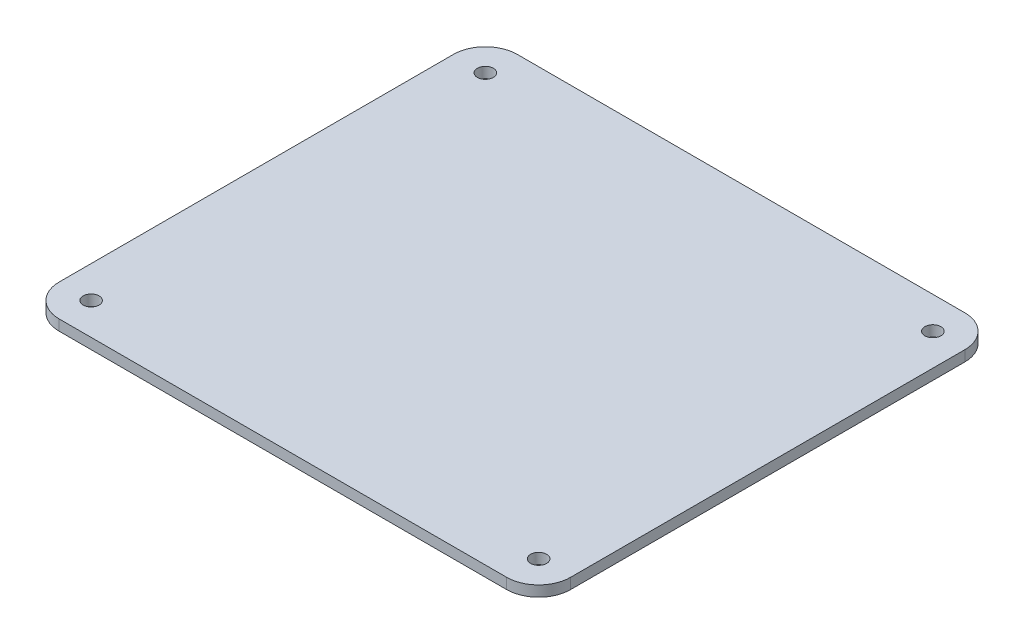
ISO-10303-21;
HEADER;
FILE_DESCRIPTION(('STEP AP214'),'2;1');
FILE_NAME('part.step','',(''),(''),'','','');
FILE_SCHEMA(('AUTOMOTIVE_DESIGN { 1 0 10303 214 1 1 1 1 }'));
ENDSEC;
DATA;
#1=APPLICATION_CONTEXT('core data for automotive mechanical design processes');
#2=APPLICATION_PROTOCOL_DEFINITION('international standard','automotive_design',2000,#1);
#3=PRODUCT_CONTEXT('',#1,'mechanical');
#4=PRODUCT('Part','Part','',(#3));
#5=PRODUCT_RELATED_PRODUCT_CATEGORY('part','',(#4));
#6=PRODUCT_DEFINITION_FORMATION('','',#4);
#7=PRODUCT_DEFINITION_CONTEXT('part definition',#1,'design');
#8=PRODUCT_DEFINITION('design','',#6,#7);
#9=PRODUCT_DEFINITION_SHAPE('','',#8);
#10=(LENGTH_UNIT() NAMED_UNIT(*) SI_UNIT(.MILLI.,.METRE.));
#11=(NAMED_UNIT(*) PLANE_ANGLE_UNIT() SI_UNIT($,.RADIAN.));
#12=(NAMED_UNIT(*) SI_UNIT($,.STERADIAN.) SOLID_ANGLE_UNIT());
#13=UNCERTAINTY_MEASURE_WITH_UNIT(LENGTH_MEASURE(1.E-05),#10,'distance_accuracy_value','');
#14=(GEOMETRIC_REPRESENTATION_CONTEXT(3) GLOBAL_UNCERTAINTY_ASSIGNED_CONTEXT((#13)) GLOBAL_UNIT_ASSIGNED_CONTEXT((#10,
#11,#12)) REPRESENTATION_CONTEXT('',''));
#15=CARTESIAN_POINT('',(0.,0.,0.));
#16=DIRECTION('',(0.,0.,1.));
#17=DIRECTION('',(1.,0.,0.));
#18=AXIS2_PLACEMENT_3D('',#15,#16,#17);
#19=CARTESIAN_POINT('',(-42.,2.,37.));
#20=DIRECTION('',(0.,-1.,0.));
#21=DIRECTION('',(0.,0.,-1.));
#22=AXIS2_PLACEMENT_3D('',#19,#20,#21);
#23=PLANE('',#22);
#24=CARTESIAN_POINT('',(-42.,2.,37.));
#25=DIRECTION('',(0.,1.,0.));
#26=DIRECTION('',(0.,0.,-1.));
#27=AXIS2_PLACEMENT_3D('',#24,#25,#26);
#28=CIRCLE('',#27,6.);
#29=CARTESIAN_POINT('',(-48.,2.,37.));
#30=VERTEX_POINT('',#29);
#31=CARTESIAN_POINT('',(-42.,2.,43.));
#32=VERTEX_POINT('',#31);
#33=EDGE_CURVE('E144',#30,#32,#28,.T.);
#34=ORIENTED_EDGE('',*,*,#33,.T.);
#35=DIRECTION('',(1.,0.,0.));
#36=VECTOR('',#35,1.);
#37=CARTESIAN_POINT('',(-42.,2.,43.));
#38=LINE('',#37,#36);
#39=CARTESIAN_POINT('',(42.,2.,43.));
#40=VERTEX_POINT('',#39);
#41=EDGE_CURVE('E92',#32,#40,#38,.T.);
#42=ORIENTED_EDGE('',*,*,#41,.T.);
#43=CARTESIAN_POINT('',(42.,2.,37.));
#44=DIRECTION('',(0.,1.,0.));
#45=DIRECTION('',(0.,0.,1.));
#46=AXIS2_PLACEMENT_3D('',#43,#44,#45);
#47=CIRCLE('',#46,6.);
#48=CARTESIAN_POINT('',(48.,2.,37.));
#49=VERTEX_POINT('',#48);
#50=EDGE_CURVE('E159',#40,#49,#47,.T.);
#51=ORIENTED_EDGE('',*,*,#50,.T.);
#52=DIRECTION('',(0.,0.,-1.));
#53=VECTOR('',#52,1.);
#54=CARTESIAN_POINT('',(48.,2.,37.));
#55=LINE('',#54,#53);
#56=CARTESIAN_POINT('',(48.,2.,-37.));
#57=VERTEX_POINT('',#56);
#58=EDGE_CURVE('E172',#49,#57,#55,.T.);
#59=ORIENTED_EDGE('',*,*,#58,.T.);
#60=CARTESIAN_POINT('',(42.,2.,-37.));
#61=DIRECTION('',(0.,1.,0.));
#62=DIRECTION('',(0.,0.,-1.));
#63=AXIS2_PLACEMENT_3D('',#60,#61,#62);
#64=CIRCLE('',#63,6.);
#65=CARTESIAN_POINT('',(42.,2.,-43.));
#66=VERTEX_POINT('',#65);
#67=EDGE_CURVE('E111',#57,#66,#64,.T.);
#68=ORIENTED_EDGE('',*,*,#67,.T.);
#69=DIRECTION('',(-1.,0.,0.));
#70=VECTOR('',#69,1.);
#71=CARTESIAN_POINT('',(-42.,2.,-43.));
#72=LINE('',#71,#70);
#73=CARTESIAN_POINT('',(-42.,2.,-43.));
#74=VERTEX_POINT('',#73);
#75=EDGE_CURVE('E105',#66,#74,#72,.T.);
#76=ORIENTED_EDGE('',*,*,#75,.T.);
#77=CARTESIAN_POINT('',(-42.,2.,-37.));
#78=DIRECTION('',(0.,1.,0.));
#79=DIRECTION('',(0.,0.,-1.));
#80=AXIS2_PLACEMENT_3D('',#77,#78,#79);
#81=CIRCLE('',#80,6.);
#82=CARTESIAN_POINT('',(-48.,2.,-37.));
#83=VERTEX_POINT('',#82);
#84=EDGE_CURVE('E109',#74,#83,#81,.T.);
#85=ORIENTED_EDGE('',*,*,#84,.T.);
#86=DIRECTION('',(0.,0.,1.));
#87=VECTOR('',#86,1.);
#88=CARTESIAN_POINT('',(-48.,2.,37.));
#89=LINE('',#88,#87);
#90=EDGE_CURVE('E49',#83,#30,#89,.T.);
#91=ORIENTED_EDGE('',*,*,#90,.T.);
#92=EDGE_LOOP('',(#34,#42,#51,#59,#68,#76,#85,#91));
#93=FACE_BOUND('',#92,.T.);
#94=CARTESIAN_POINT('',(-42.,2.,-37.));
#95=DIRECTION('',(0.,1.,0.));
#96=DIRECTION('',(0.,0.,1.));
#97=AXIS2_PLACEMENT_3D('',#94,#95,#96);
#98=CIRCLE('',#97,1.5);
#99=CARTESIAN_POINT('',(-42.,2.,-35.5));
#100=VERTEX_POINT('',#99);
#101=EDGE_CURVE('E133',#100,#100,#98,.T.);
#102=ORIENTED_EDGE('',*,*,#101,.F.);
#103=EDGE_LOOP('',(#102));
#104=FACE_BOUND('',#103,.T.);
#105=CARTESIAN_POINT('',(42.,2.,-37.));
#106=DIRECTION('',(0.,1.,0.));
#107=DIRECTION('',(0.,0.,1.));
#108=AXIS2_PLACEMENT_3D('',#105,#106,#107);
#109=CIRCLE('',#108,1.5);
#110=CARTESIAN_POINT('',(42.,2.,-35.5));
#111=VERTEX_POINT('',#110);
#112=EDGE_CURVE('E181',#111,#111,#109,.T.);
#113=ORIENTED_EDGE('',*,*,#112,.F.);
#114=EDGE_LOOP('',(#113));
#115=FACE_BOUND('',#114,.T.);
#116=CARTESIAN_POINT('',(42.,2.,37.));
#117=DIRECTION('',(0.,1.,0.));
#118=DIRECTION('',(0.,0.,1.));
#119=AXIS2_PLACEMENT_3D('',#116,#117,#118);
#120=CIRCLE('',#119,1.5);
#121=CARTESIAN_POINT('',(42.,2.,38.5));
#122=VERTEX_POINT('',#121);
#123=EDGE_CURVE('E187',#122,#122,#120,.T.);
#124=ORIENTED_EDGE('',*,*,#123,.F.);
#125=EDGE_LOOP('',(#124));
#126=FACE_BOUND('',#125,.T.);
#127=CARTESIAN_POINT('',(-42.,2.,37.));
#128=DIRECTION('',(0.,1.,0.));
#129=DIRECTION('',(0.,0.,1.));
#130=AXIS2_PLACEMENT_3D('',#127,#128,#129);
#131=CIRCLE('',#130,1.5);
#132=CARTESIAN_POINT('',(-42.,2.,38.5));
#133=VERTEX_POINT('',#132);
#134=EDGE_CURVE('E193',#133,#133,#131,.T.);
#135=ORIENTED_EDGE('',*,*,#134,.F.);
#136=EDGE_LOOP('',(#135));
#137=FACE_BOUND('',#136,.T.);
#138=ADVANCED_FACE('F32',(#93,#104,#115,#126,#137),#23,.F.);
#139=CARTESIAN_POINT('',(-42.,0.,37.));
#140=DIRECTION('',(0.,-1.,0.));
#141=DIRECTION('',(0.,0.,-1.));
#142=AXIS2_PLACEMENT_3D('',#139,#140,#141);
#143=PLANE('',#142);
#144=CARTESIAN_POINT('',(42.,0.,37.));
#145=DIRECTION('',(0.,1.,0.));
#146=DIRECTION('',(0.,0.,1.));
#147=AXIS2_PLACEMENT_3D('',#144,#145,#146);
#148=CIRCLE('',#147,1.5);
#149=CARTESIAN_POINT('',(42.,0.,38.5));
#150=VERTEX_POINT('',#149);
#151=EDGE_CURVE('E190',#150,#150,#148,.T.);
#152=ORIENTED_EDGE('',*,*,#151,.T.);
#153=EDGE_LOOP('',(#152));
#154=FACE_BOUND('',#153,.T.);
#155=CARTESIAN_POINT('',(-42.,0.,-37.));
#156=DIRECTION('',(0.,1.,0.));
#157=DIRECTION('',(0.,0.,1.));
#158=AXIS2_PLACEMENT_3D('',#155,#156,#157);
#159=CIRCLE('',#158,1.5);
#160=CARTESIAN_POINT('',(-42.,0.,-35.5));
#161=VERTEX_POINT('',#160);
#162=EDGE_CURVE('E178',#161,#161,#159,.T.);
#163=ORIENTED_EDGE('',*,*,#162,.T.);
#164=EDGE_LOOP('',(#163));
#165=FACE_BOUND('',#164,.T.);
#166=CARTESIAN_POINT('',(-42.,0.,37.));
#167=DIRECTION('',(0.,1.,0.));
#168=DIRECTION('',(0.,0.,-1.));
#169=AXIS2_PLACEMENT_3D('',#166,#167,#168);
#170=CIRCLE('',#169,6.);
#171=CARTESIAN_POINT('',(-48.,0.,37.));
#172=VERTEX_POINT('',#171);
#173=CARTESIAN_POINT('',(-42.,0.,43.));
#174=VERTEX_POINT('',#173);
#175=EDGE_CURVE('E129',#172,#174,#170,.T.);
#176=ORIENTED_EDGE('',*,*,#175,.F.);
#177=DIRECTION('',(0.,0.,1.));
#178=VECTOR('',#177,1.);
#179=CARTESIAN_POINT('',(-48.,0.,37.));
#180=LINE('',#179,#178);
#181=CARTESIAN_POINT('',(-48.,0.,-37.));
#182=VERTEX_POINT('',#181);
#183=EDGE_CURVE('E84',#182,#172,#180,.T.);
#184=ORIENTED_EDGE('',*,*,#183,.F.);
#185=CARTESIAN_POINT('',(-42.,0.,-37.));
#186=DIRECTION('',(0.,1.,0.));
#187=DIRECTION('',(0.,0.,-1.));
#188=AXIS2_PLACEMENT_3D('',#185,#186,#187);
#189=CIRCLE('',#188,6.);
#190=CARTESIAN_POINT('',(-42.,0.,-43.));
#191=VERTEX_POINT('',#190);
#192=EDGE_CURVE('E78',#191,#182,#189,.T.);
#193=ORIENTED_EDGE('',*,*,#192,.F.);
#194=DIRECTION('',(-1.,0.,0.));
#195=VECTOR('',#194,1.);
#196=CARTESIAN_POINT('',(-42.,0.,-43.));
#197=LINE('',#196,#195);
#198=CARTESIAN_POINT('',(42.,0.,-43.));
#199=VERTEX_POINT('',#198);
#200=EDGE_CURVE('E119',#199,#191,#197,.T.);
#201=ORIENTED_EDGE('',*,*,#200,.F.);
#202=CARTESIAN_POINT('',(42.,0.,-37.));
#203=DIRECTION('',(0.,1.,0.));
#204=DIRECTION('',(0.,0.,-1.));
#205=AXIS2_PLACEMENT_3D('',#202,#203,#204);
#206=CIRCLE('',#205,6.);
#207=CARTESIAN_POINT('',(48.,0.,-37.));
#208=VERTEX_POINT('',#207);
#209=EDGE_CURVE('E139',#208,#199,#206,.T.);
#210=ORIENTED_EDGE('',*,*,#209,.F.);
#211=DIRECTION('',(0.,0.,-1.));
#212=VECTOR('',#211,1.);
#213=CARTESIAN_POINT('',(48.,0.,37.));
#214=LINE('',#213,#212);
#215=CARTESIAN_POINT('',(48.,0.,37.));
#216=VERTEX_POINT('',#215);
#217=EDGE_CURVE('E137',#216,#208,#214,.T.);
#218=ORIENTED_EDGE('',*,*,#217,.F.);
#219=CARTESIAN_POINT('',(42.,0.,37.));
#220=DIRECTION('',(0.,1.,0.));
#221=DIRECTION('',(0.,0.,1.));
#222=AXIS2_PLACEMENT_3D('',#219,#220,#221);
#223=CIRCLE('',#222,6.);
#224=CARTESIAN_POINT('',(42.,0.,43.));
#225=VERTEX_POINT('',#224);
#226=EDGE_CURVE('E135',#225,#216,#223,.T.);
#227=ORIENTED_EDGE('',*,*,#226,.F.);
#228=DIRECTION('',(1.,0.,0.));
#229=VECTOR('',#228,1.);
#230=CARTESIAN_POINT('',(-42.,0.,43.));
#231=LINE('',#230,#229);
#232=EDGE_CURVE('E132',#174,#225,#231,.T.);
#233=ORIENTED_EDGE('',*,*,#232,.F.);
#234=EDGE_LOOP('',(#176,#184,#193,#201,#210,#218,#227,#233));
#235=FACE_BOUND('',#234,.T.);
#236=CARTESIAN_POINT('',(42.,0.,-37.));
#237=DIRECTION('',(0.,1.,0.));
#238=DIRECTION('',(0.,0.,1.));
#239=AXIS2_PLACEMENT_3D('',#236,#237,#238);
#240=CIRCLE('',#239,1.5);
#241=CARTESIAN_POINT('',(42.,0.,-35.5));
#242=VERTEX_POINT('',#241);
#243=EDGE_CURVE('E184',#242,#242,#240,.T.);
#244=ORIENTED_EDGE('',*,*,#243,.T.);
#245=EDGE_LOOP('',(#244));
#246=FACE_BOUND('',#245,.T.);
#247=CARTESIAN_POINT('',(-42.,0.,37.));
#248=DIRECTION('',(0.,1.,0.));
#249=DIRECTION('',(0.,0.,1.));
#250=AXIS2_PLACEMENT_3D('',#247,#248,#249);
#251=CIRCLE('',#250,1.5);
#252=CARTESIAN_POINT('',(-42.,0.,38.5));
#253=VERTEX_POINT('',#252);
#254=EDGE_CURVE('E196',#253,#253,#251,.T.);
#255=ORIENTED_EDGE('',*,*,#254,.T.);
#256=EDGE_LOOP('',(#255));
#257=FACE_BOUND('',#256,.T.);
#258=ADVANCED_FACE('F163',(#154,#165,#235,#246,#257),#143,.T.);
#259=CARTESIAN_POINT('',(-42.,2.,37.));
#260=DIRECTION('',(0.,-1.,0.));
#261=DIRECTION('',(0.,0.,-1.));
#262=AXIS2_PLACEMENT_3D('',#259,#260,#261);
#263=CYLINDRICAL_SURFACE('',#262,6.);
#264=ORIENTED_EDGE('',*,*,#175,.T.);
#265=DIRECTION('',(0.,-1.,0.));
#266=VECTOR('',#265,1.);
#267=CARTESIAN_POINT('',(-42.,2.,43.));
#268=LINE('',#267,#266);
#269=EDGE_CURVE('E11',#32,#174,#268,.T.);
#270=ORIENTED_EDGE('',*,*,#269,.F.);
#271=ORIENTED_EDGE('',*,*,#33,.F.);
#272=DIRECTION('',(0.,-1.,0.));
#273=VECTOR('',#272,1.);
#274=CARTESIAN_POINT('',(-48.,2.,37.));
#275=LINE('',#274,#273);
#276=EDGE_CURVE('E125',#30,#172,#275,.T.);
#277=ORIENTED_EDGE('',*,*,#276,.T.);
#278=EDGE_LOOP('',(#264,#270,#271,#277));
#279=FACE_BOUND('',#278,.T.);
#280=ADVANCED_FACE('F34',(#279),#263,.T.);
#281=CARTESIAN_POINT('',(-42.,2.,43.));
#282=DIRECTION('',(0.,0.,-1.));
#283=DIRECTION('',(-1.,0.,0.));
#284=AXIS2_PLACEMENT_3D('',#281,#282,#283);
#285=PLANE('',#284);
#286=ORIENTED_EDGE('',*,*,#232,.T.);
#287=DIRECTION('',(0.,-1.,0.));
#288=VECTOR('',#287,1.);
#289=CARTESIAN_POINT('',(42.,2.,43.));
#290=LINE('',#289,#288);
#291=EDGE_CURVE('E41',#40,#225,#290,.T.);
#292=ORIENTED_EDGE('',*,*,#291,.F.);
#293=ORIENTED_EDGE('',*,*,#41,.F.);
#294=ORIENTED_EDGE('',*,*,#269,.T.);
#295=EDGE_LOOP('',(#286,#292,#293,#294));
#296=FACE_BOUND('',#295,.T.);
#297=ADVANCED_FACE('F228',(#296),#285,.F.);
#298=CARTESIAN_POINT('',(42.,2.,37.));
#299=DIRECTION('',(0.,-1.,0.));
#300=DIRECTION('',(0.,0.,-1.));
#301=AXIS2_PLACEMENT_3D('',#298,#299,#300);
#302=CYLINDRICAL_SURFACE('',#301,6.);
#303=ORIENTED_EDGE('',*,*,#226,.T.);
#304=DIRECTION('',(0.,-1.,0.));
#305=VECTOR('',#304,1.);
#306=CARTESIAN_POINT('',(48.,2.,37.));
#307=LINE('',#306,#305);
#308=EDGE_CURVE('E151',#49,#216,#307,.T.);
#309=ORIENTED_EDGE('',*,*,#308,.F.);
#310=ORIENTED_EDGE('',*,*,#50,.F.);
#311=ORIENTED_EDGE('',*,*,#291,.T.);
#312=EDGE_LOOP('',(#303,#309,#310,#311));
#313=FACE_BOUND('',#312,.T.);
#314=ADVANCED_FACE('F157',(#313),#302,.T.);
#315=CARTESIAN_POINT('',(48.,2.,37.));
#316=DIRECTION('',(-1.,0.,0.));
#317=DIRECTION('',(0.,0.,1.));
#318=AXIS2_PLACEMENT_3D('',#315,#316,#317);
#319=PLANE('',#318);
#320=ORIENTED_EDGE('',*,*,#217,.T.);
#321=DIRECTION('',(0.,-1.,0.));
#322=VECTOR('',#321,1.);
#323=CARTESIAN_POINT('',(48.,2.,-37.));
#324=LINE('',#323,#322);
#325=EDGE_CURVE('E148',#57,#208,#324,.T.);
#326=ORIENTED_EDGE('',*,*,#325,.F.);
#327=ORIENTED_EDGE('',*,*,#58,.F.);
#328=ORIENTED_EDGE('',*,*,#308,.T.);
#329=EDGE_LOOP('',(#320,#326,#327,#328));
#330=FACE_BOUND('',#329,.T.);
#331=ADVANCED_FACE('F168',(#330),#319,.F.);
#332=CARTESIAN_POINT('',(42.,2.,-37.));
#333=DIRECTION('',(0.,-1.,0.));
#334=DIRECTION('',(0.,0.,-1.));
#335=AXIS2_PLACEMENT_3D('',#332,#333,#334);
#336=CYLINDRICAL_SURFACE('',#335,6.);
#337=ORIENTED_EDGE('',*,*,#209,.T.);
#338=DIRECTION('',(0.,-1.,0.));
#339=VECTOR('',#338,1.);
#340=CARTESIAN_POINT('',(42.,2.,-43.));
#341=LINE('',#340,#339);
#342=EDGE_CURVE('E120',#66,#199,#341,.T.);
#343=ORIENTED_EDGE('',*,*,#342,.F.);
#344=ORIENTED_EDGE('',*,*,#67,.F.);
#345=ORIENTED_EDGE('',*,*,#325,.T.);
#346=EDGE_LOOP('',(#337,#343,#344,#345));
#347=FACE_BOUND('',#346,.T.);
#348=ADVANCED_FACE('F171',(#347),#336,.T.);
#349=CARTESIAN_POINT('',(-42.,2.,-43.));
#350=DIRECTION('',(0.,0.,1.));
#351=DIRECTION('',(1.,0.,0.));
#352=AXIS2_PLACEMENT_3D('',#349,#350,#351);
#353=PLANE('',#352);
#354=ORIENTED_EDGE('',*,*,#200,.T.);
#355=DIRECTION('',(0.,-1.,0.));
#356=VECTOR('',#355,1.);
#357=CARTESIAN_POINT('',(-42.,2.,-43.));
#358=LINE('',#357,#356);
#359=EDGE_CURVE('E116',#74,#191,#358,.T.);
#360=ORIENTED_EDGE('',*,*,#359,.F.);
#361=ORIENTED_EDGE('',*,*,#75,.F.);
#362=ORIENTED_EDGE('',*,*,#342,.T.);
#363=EDGE_LOOP('',(#354,#360,#361,#362));
#364=FACE_BOUND('',#363,.T.);
#365=ADVANCED_FACE('F117',(#364),#353,.F.);
#366=CARTESIAN_POINT('',(-42.,2.,-37.));
#367=DIRECTION('',(0.,-1.,0.));
#368=DIRECTION('',(0.,0.,-1.));
#369=AXIS2_PLACEMENT_3D('',#366,#367,#368);
#370=CYLINDRICAL_SURFACE('',#369,6.);
#371=ORIENTED_EDGE('',*,*,#192,.T.);
#372=DIRECTION('',(0.,-1.,0.));
#373=VECTOR('',#372,1.);
#374=CARTESIAN_POINT('',(-48.,2.,-37.));
#375=LINE('',#374,#373);
#376=EDGE_CURVE('E121',#83,#182,#375,.T.);
#377=ORIENTED_EDGE('',*,*,#376,.F.);
#378=ORIENTED_EDGE('',*,*,#84,.F.);
#379=ORIENTED_EDGE('',*,*,#359,.T.);
#380=EDGE_LOOP('',(#371,#377,#378,#379));
#381=FACE_BOUND('',#380,.T.);
#382=ADVANCED_FACE('F123',(#381),#370,.T.);
#383=CARTESIAN_POINT('',(-48.,2.,37.));
#384=DIRECTION('',(1.,0.,0.));
#385=DIRECTION('',(0.,0.,-1.));
#386=AXIS2_PLACEMENT_3D('',#383,#384,#385);
#387=PLANE('',#386);
#388=ORIENTED_EDGE('',*,*,#183,.T.);
#389=ORIENTED_EDGE('',*,*,#276,.F.);
#390=ORIENTED_EDGE('',*,*,#90,.F.);
#391=ORIENTED_EDGE('',*,*,#376,.T.);
#392=EDGE_LOOP('',(#388,#389,#390,#391));
#393=FACE_BOUND('',#392,.T.);
#394=ADVANCED_FACE('F216',(#393),#387,.F.);
#395=CARTESIAN_POINT('',(-42.,2.,-37.));
#396=DIRECTION('',(0.,-1.,0.));
#397=DIRECTION('',(0.,0.,-1.));
#398=AXIS2_PLACEMENT_3D('',#395,#396,#397);
#399=CYLINDRICAL_SURFACE('',#398,1.5);
#400=ORIENTED_EDGE('',*,*,#101,.T.);
#401=EDGE_LOOP('',(#400));
#402=FACE_BOUND('',#401,.T.);
#403=ORIENTED_EDGE('',*,*,#162,.F.);
#404=EDGE_LOOP('',(#403));
#405=FACE_BOUND('',#404,.T.);
#406=ADVANCED_FACE('F213',(#402,#405),#399,.F.);
#407=CARTESIAN_POINT('',(42.,2.,-37.));
#408=DIRECTION('',(0.,-1.,0.));
#409=DIRECTION('',(0.,0.,-1.));
#410=AXIS2_PLACEMENT_3D('',#407,#408,#409);
#411=CYLINDRICAL_SURFACE('',#410,1.5);
#412=ORIENTED_EDGE('',*,*,#112,.T.);
#413=EDGE_LOOP('',(#412));
#414=FACE_BOUND('',#413,.T.);
#415=ORIENTED_EDGE('',*,*,#243,.F.);
#416=EDGE_LOOP('',(#415));
#417=FACE_BOUND('',#416,.T.);
#418=ADVANCED_FACE('F292',(#414,#417),#411,.F.);
#419=CARTESIAN_POINT('',(42.,2.,37.));
#420=DIRECTION('',(0.,-1.,0.));
#421=DIRECTION('',(0.,0.,-1.));
#422=AXIS2_PLACEMENT_3D('',#419,#420,#421);
#423=CYLINDRICAL_SURFACE('',#422,1.5);
#424=ORIENTED_EDGE('',*,*,#123,.T.);
#425=EDGE_LOOP('',(#424));
#426=FACE_BOUND('',#425,.T.);
#427=ORIENTED_EDGE('',*,*,#151,.F.);
#428=EDGE_LOOP('',(#427));
#429=FACE_BOUND('',#428,.T.);
#430=ADVANCED_FACE('F300',(#426,#429),#423,.F.);
#431=CARTESIAN_POINT('',(-42.,2.,37.));
#432=DIRECTION('',(0.,-1.,0.));
#433=DIRECTION('',(0.,0.,-1.));
#434=AXIS2_PLACEMENT_3D('',#431,#432,#433);
#435=CYLINDRICAL_SURFACE('',#434,1.5);
#436=ORIENTED_EDGE('',*,*,#134,.T.);
#437=EDGE_LOOP('',(#436));
#438=FACE_BOUND('',#437,.T.);
#439=ORIENTED_EDGE('',*,*,#254,.F.);
#440=EDGE_LOOP('',(#439));
#441=FACE_BOUND('',#440,.T.);
#442=ADVANCED_FACE('F202',(#438,#441),#435,.F.);
#443=CLOSED_SHELL('',(#138,#258,#280,#297,#314,#331,#348,#365,#382,#394,#406,#418,#430,#442));
#444=MANIFOLD_SOLID_BREP('B2',#443);
#445=ADVANCED_BREP_SHAPE_REPRESENTATION('',(#18,#444),#14);
#446=SHAPE_DEFINITION_REPRESENTATION(#9,#445);
ENDSEC;
END-ISO-10303-21;
